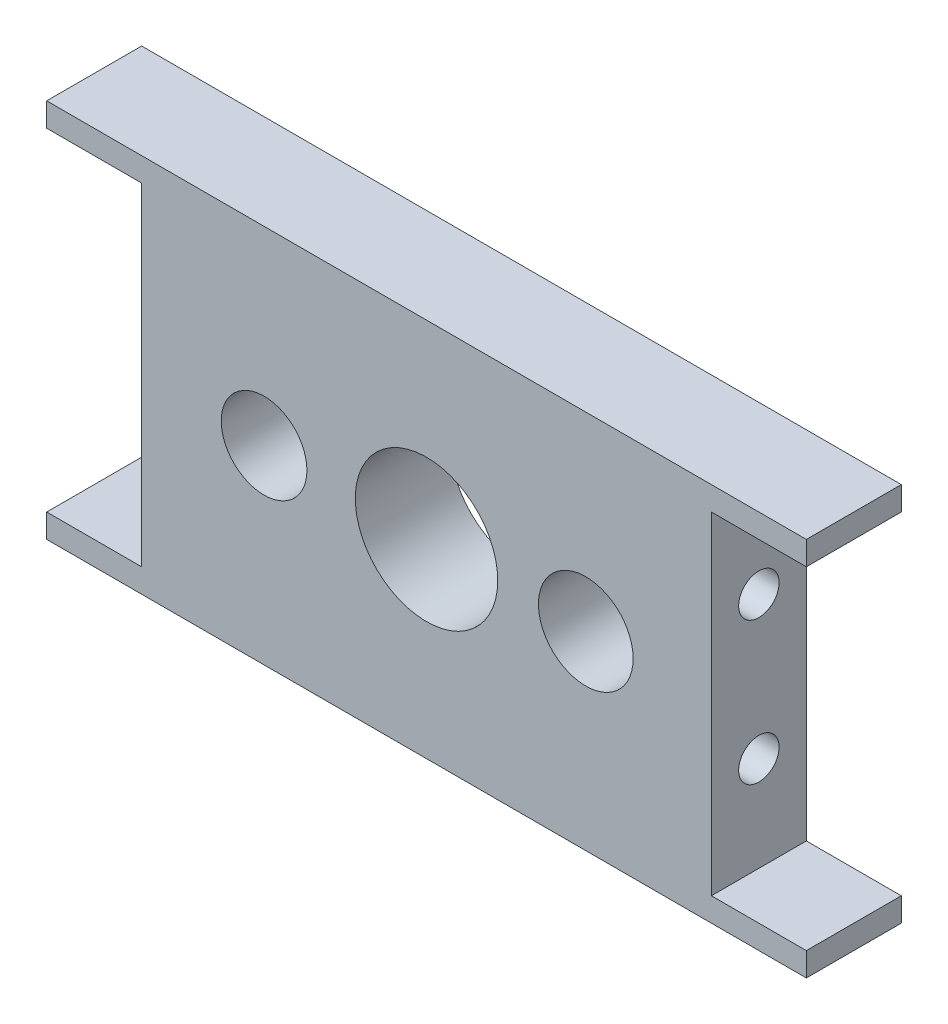
ISO-10303-21;
HEADER;
FILE_DESCRIPTION(('STEP AP214'),'2;1');
FILE_NAME('part.step','',(''),(''),'','','');
FILE_SCHEMA(('AUTOMOTIVE_DESIGN { 1 0 10303 214 1 1 1 1 }'));
ENDSEC;
DATA;
#1=APPLICATION_CONTEXT('core data for automotive mechanical design processes');
#2=APPLICATION_PROTOCOL_DEFINITION('international standard','automotive_design',2000,#1);
#3=PRODUCT_CONTEXT('',#1,'mechanical');
#4=PRODUCT('Part','Part','',(#3));
#5=PRODUCT_RELATED_PRODUCT_CATEGORY('part','',(#4));
#6=PRODUCT_DEFINITION_FORMATION('','',#4);
#7=PRODUCT_DEFINITION_CONTEXT('part definition',#1,'design');
#8=PRODUCT_DEFINITION('design','',#6,#7);
#9=PRODUCT_DEFINITION_SHAPE('','',#8);
#10=(LENGTH_UNIT() NAMED_UNIT(*) SI_UNIT(.MILLI.,.METRE.));
#11=(NAMED_UNIT(*) PLANE_ANGLE_UNIT() SI_UNIT($,.RADIAN.));
#12=(NAMED_UNIT(*) SI_UNIT($,.STERADIAN.) SOLID_ANGLE_UNIT());
#13=UNCERTAINTY_MEASURE_WITH_UNIT(LENGTH_MEASURE(1.E-05),#10,'distance_accuracy_value','');
#14=(GEOMETRIC_REPRESENTATION_CONTEXT(3) GLOBAL_UNCERTAINTY_ASSIGNED_CONTEXT((#13)) GLOBAL_UNIT_ASSIGNED_CONTEXT((#10,
#11,#12)) REPRESENTATION_CONTEXT('',''));
#15=CARTESIAN_POINT('',(0.,0.,0.));
#16=DIRECTION('',(0.,0.,1.));
#17=DIRECTION('',(1.,0.,0.));
#18=AXIS2_PLACEMENT_3D('',#15,#16,#17);
#19=CARTESIAN_POINT('',(0.,0.,6.35));
#20=DIRECTION('',(0.,0.,-1.));
#21=DIRECTION('',(-1.,0.,0.));
#22=AXIS2_PLACEMENT_3D('',#19,#20,#21);
#23=PLANE('',#22);
#24=CARTESIAN_POINT('',(-10.8631003337967,0.,6.35));
#25=DIRECTION('',(0.,0.,1.));
#26=DIRECTION('',(1.,0.,0.));
#27=AXIS2_PLACEMENT_3D('',#24,#25,#26);
#28=CIRCLE('',#27,2.8656483897361);
#29=CARTESIAN_POINT('',(-7.99745194406057,0.,6.35));
#30=VERTEX_POINT('',#29);
#31=EDGE_CURVE('E346',#30,#30,#28,.T.);
#32=ORIENTED_EDGE('',*,*,#31,.F.);
#33=EDGE_LOOP('',(#32));
#34=FACE_BOUND('',#33,.T.);
#35=DIRECTION('',(0.,1.,0.));
#36=VECTOR('',#35,1.);
#37=CARTESIAN_POINT('',(25.4,12.7,6.35));
#38=LINE('',#37,#36);
#39=CARTESIAN_POINT('',(25.4,11.1125,6.35));
#40=VERTEX_POINT('',#39);
#41=CARTESIAN_POINT('',(25.4,12.7,6.35));
#42=VERTEX_POINT('',#41);
#43=EDGE_CURVE('E179',#40,#42,#38,.T.);
#44=ORIENTED_EDGE('',*,*,#43,.T.);
#45=DIRECTION('',(-1.,0.,0.));
#46=VECTOR('',#45,1.);
#47=CARTESIAN_POINT('',(25.4,12.7,6.35));
#48=LINE('',#47,#46);
#49=CARTESIAN_POINT('',(-25.4,12.7,6.35));
#50=VERTEX_POINT('',#49);
#51=EDGE_CURVE('E105',#42,#50,#48,.T.);
#52=ORIENTED_EDGE('',*,*,#51,.T.);
#53=DIRECTION('',(0.,-1.,0.));
#54=VECTOR('',#53,1.);
#55=CARTESIAN_POINT('',(-25.4,12.7,6.35));
#56=LINE('',#55,#54);
#57=CARTESIAN_POINT('',(-25.4,11.1125,6.35));
#58=VERTEX_POINT('',#57);
#59=EDGE_CURVE('E206',#50,#58,#56,.T.);
#60=ORIENTED_EDGE('',*,*,#59,.T.);
#61=DIRECTION('',(1.,0.,0.));
#62=VECTOR('',#61,1.);
#63=CARTESIAN_POINT('',(-25.4,11.1125,6.35));
#64=LINE('',#63,#62);
#65=CARTESIAN_POINT('',(-19.05,11.1125,6.35));
#66=VERTEX_POINT('',#65);
#67=EDGE_CURVE('E225',#58,#66,#64,.T.);
#68=ORIENTED_EDGE('',*,*,#67,.T.);
#69=DIRECTION('',(0.,-1.,0.));
#70=VECTOR('',#69,1.);
#71=CARTESIAN_POINT('',(-19.05,11.1125,6.35));
#72=LINE('',#71,#70);
#73=CARTESIAN_POINT('',(-19.05,-11.1125,6.35));
#74=VERTEX_POINT('',#73);
#75=EDGE_CURVE('E222',#66,#74,#72,.T.);
#76=ORIENTED_EDGE('',*,*,#75,.T.);
#77=DIRECTION('',(-1.,0.,0.));
#78=VECTOR('',#77,1.);
#79=CARTESIAN_POINT('',(-25.4,-11.1125,6.35));
#80=LINE('',#79,#78);
#81=CARTESIAN_POINT('',(-25.4,-11.1125,6.35));
#82=VERTEX_POINT('',#81);
#83=EDGE_CURVE('E224',#74,#82,#80,.T.);
#84=ORIENTED_EDGE('',*,*,#83,.T.);
#85=DIRECTION('',(0.,-1.,0.));
#86=VECTOR('',#85,1.);
#87=CARTESIAN_POINT('',(-25.4,-11.1125,6.35));
#88=LINE('',#87,#86);
#89=CARTESIAN_POINT('',(-25.4,-12.7,6.35));
#90=VERTEX_POINT('',#89);
#91=EDGE_CURVE('E227',#82,#90,#88,.T.);
#92=ORIENTED_EDGE('',*,*,#91,.T.);
#93=DIRECTION('',(1.,0.,0.));
#94=VECTOR('',#93,1.);
#95=CARTESIAN_POINT('',(25.4,-12.7,6.35));
#96=LINE('',#95,#94);
#97=CARTESIAN_POINT('',(25.4,-12.7,6.35));
#98=VERTEX_POINT('',#97);
#99=EDGE_CURVE('E233',#90,#98,#96,.T.);
#100=ORIENTED_EDGE('',*,*,#99,.T.);
#101=DIRECTION('',(0.,1.,0.));
#102=VECTOR('',#101,1.);
#103=CARTESIAN_POINT('',(25.4,-11.1125,6.35));
#104=LINE('',#103,#102);
#105=CARTESIAN_POINT('',(25.4,-11.1125,6.35));
#106=VERTEX_POINT('',#105);
#107=EDGE_CURVE('E138',#98,#106,#104,.T.);
#108=ORIENTED_EDGE('',*,*,#107,.T.);
#109=DIRECTION('',(-1.,0.,0.));
#110=VECTOR('',#109,1.);
#111=CARTESIAN_POINT('',(25.4,-11.1125,6.35));
#112=LINE('',#111,#110);
#113=CARTESIAN_POINT('',(19.05,-11.1125,6.35));
#114=VERTEX_POINT('',#113);
#115=EDGE_CURVE('E132',#106,#114,#112,.T.);
#116=ORIENTED_EDGE('',*,*,#115,.T.);
#117=DIRECTION('',(0.,1.,0.));
#118=VECTOR('',#117,1.);
#119=CARTESIAN_POINT('',(19.05,11.1125,6.35));
#120=LINE('',#119,#118);
#121=CARTESIAN_POINT('',(19.05,11.1125,6.35));
#122=VERTEX_POINT('',#121);
#123=EDGE_CURVE('E136',#114,#122,#120,.T.);
#124=ORIENTED_EDGE('',*,*,#123,.T.);
#125=DIRECTION('',(1.,0.,0.));
#126=VECTOR('',#125,1.);
#127=CARTESIAN_POINT('',(25.4,11.1125,6.35));
#128=LINE('',#127,#126);
#129=EDGE_CURVE('E49',#122,#40,#128,.T.);
#130=ORIENTED_EDGE('',*,*,#129,.T.);
#131=EDGE_LOOP('',(#44,#52,#60,#68,#76,#84,#92,#100,#108,#116,#124,#130));
#132=FACE_BOUND('',#131,.T.);
#133=CARTESIAN_POINT('',(0.,0.,6.35));
#134=DIRECTION('',(0.,0.,1.));
#135=DIRECTION('',(1.,0.,0.));
#136=AXIS2_PLACEMENT_3D('',#133,#134,#135);
#137=CIRCLE('',#136,4.7625);
#138=CARTESIAN_POINT('',(4.7625,0.,6.35));
#139=VERTEX_POINT('',#138);
#140=EDGE_CURVE('E160',#139,#139,#137,.T.);
#141=ORIENTED_EDGE('',*,*,#140,.F.);
#142=EDGE_LOOP('',(#141));
#143=FACE_BOUND('',#142,.T.);
#144=CARTESIAN_POINT('',(10.6500983664673,0.,6.35));
#145=DIRECTION('',(0.,0.,1.));
#146=DIRECTION('',(1.,0.,0.));
#147=AXIS2_PLACEMENT_3D('',#144,#145,#146);
#148=CIRCLE('',#147,3.16650188963215);
#149=CARTESIAN_POINT('',(13.8166002560994,0.,6.35));
#150=VERTEX_POINT('',#149);
#151=EDGE_CURVE('E340',#150,#150,#148,.T.);
#152=ORIENTED_EDGE('',*,*,#151,.F.);
#153=EDGE_LOOP('',(#152));
#154=FACE_BOUND('',#153,.T.);
#155=ADVANCED_FACE('F32',(#34,#132,#143,#154),#23,.F.);
#156=CARTESIAN_POINT('',(0.,0.,0.));
#157=DIRECTION('',(0.,0.,-1.));
#158=DIRECTION('',(-1.,0.,0.));
#159=AXIS2_PLACEMENT_3D('',#156,#157,#158);
#160=PLANE('',#159);
#161=CARTESIAN_POINT('',(-10.8631003337967,0.,0.));
#162=DIRECTION('',(0.,0.,1.));
#163=DIRECTION('',(1.,0.,0.));
#164=AXIS2_PLACEMENT_3D('',#161,#162,#163);
#165=CIRCLE('',#164,2.8656483897361);
#166=CARTESIAN_POINT('',(-7.99745194406057,0.,0.));
#167=VERTEX_POINT('',#166);
#168=EDGE_CURVE('E343',#167,#167,#165,.T.);
#169=ORIENTED_EDGE('',*,*,#168,.T.);
#170=EDGE_LOOP('',(#169));
#171=FACE_BOUND('',#170,.T.);
#172=DIRECTION('',(0.,1.,0.));
#173=VECTOR('',#172,1.);
#174=CARTESIAN_POINT('',(25.4,12.7,0.));
#175=LINE('',#174,#173);
#176=CARTESIAN_POINT('',(25.4,11.1125,0.));
#177=VERTEX_POINT('',#176);
#178=CARTESIAN_POINT('',(25.4,12.7,0.));
#179=VERTEX_POINT('',#178);
#180=EDGE_CURVE('E156',#177,#179,#175,.T.);
#181=ORIENTED_EDGE('',*,*,#180,.F.);
#182=DIRECTION('',(1.,0.,0.));
#183=VECTOR('',#182,1.);
#184=CARTESIAN_POINT('',(25.4,11.1125,0.));
#185=LINE('',#184,#183);
#186=CARTESIAN_POINT('',(19.05,11.1125,0.));
#187=VERTEX_POINT('',#186);
#188=EDGE_CURVE('E97',#187,#177,#185,.T.);
#189=ORIENTED_EDGE('',*,*,#188,.F.);
#190=DIRECTION('',(0.,1.,0.));
#191=VECTOR('',#190,1.);
#192=CARTESIAN_POINT('',(19.05,11.1125,0.));
#193=LINE('',#192,#191);
#194=CARTESIAN_POINT('',(19.05,-11.1125,0.));
#195=VERTEX_POINT('',#194);
#196=EDGE_CURVE('E91',#195,#187,#193,.T.);
#197=ORIENTED_EDGE('',*,*,#196,.F.);
#198=DIRECTION('',(-1.,0.,0.));
#199=VECTOR('',#198,1.);
#200=CARTESIAN_POINT('',(25.4,-11.1125,0.));
#201=LINE('',#200,#199);
#202=CARTESIAN_POINT('',(25.4,-11.1125,0.));
#203=VERTEX_POINT('',#202);
#204=EDGE_CURVE('E146',#203,#195,#201,.T.);
#205=ORIENTED_EDGE('',*,*,#204,.F.);
#206=DIRECTION('',(0.,1.,0.));
#207=VECTOR('',#206,1.);
#208=CARTESIAN_POINT('',(25.4,-11.1125,0.));
#209=LINE('',#208,#207);
#210=CARTESIAN_POINT('',(25.4,-12.7,0.));
#211=VERTEX_POINT('',#210);
#212=EDGE_CURVE('E174',#211,#203,#209,.T.);
#213=ORIENTED_EDGE('',*,*,#212,.F.);
#214=DIRECTION('',(1.,0.,0.));
#215=VECTOR('',#214,1.);
#216=CARTESIAN_POINT('',(25.4,-12.7,0.));
#217=LINE('',#216,#215);
#218=CARTESIAN_POINT('',(-25.4,-12.7,0.));
#219=VERTEX_POINT('',#218);
#220=EDGE_CURVE('E172',#219,#211,#217,.T.);
#221=ORIENTED_EDGE('',*,*,#220,.F.);
#222=DIRECTION('',(0.,-1.,0.));
#223=VECTOR('',#222,1.);
#224=CARTESIAN_POINT('',(-25.4,-11.1125,0.));
#225=LINE('',#224,#223);
#226=CARTESIAN_POINT('',(-25.4,-11.1125,0.));
#227=VERTEX_POINT('',#226);
#228=EDGE_CURVE('E170',#227,#219,#225,.T.);
#229=ORIENTED_EDGE('',*,*,#228,.F.);
#230=DIRECTION('',(-1.,0.,0.));
#231=VECTOR('',#230,1.);
#232=CARTESIAN_POINT('',(-25.4,-11.1125,0.));
#233=LINE('',#232,#231);
#234=CARTESIAN_POINT('',(-19.05,-11.1125,0.));
#235=VERTEX_POINT('',#234);
#236=EDGE_CURVE('E168',#235,#227,#233,.T.);
#237=ORIENTED_EDGE('',*,*,#236,.F.);
#238=DIRECTION('',(0.,-1.,0.));
#239=VECTOR('',#238,1.);
#240=CARTESIAN_POINT('',(-19.05,11.1125,0.));
#241=LINE('',#240,#239);
#242=CARTESIAN_POINT('',(-19.05,11.1125,0.));
#243=VERTEX_POINT('',#242);
#244=EDGE_CURVE('E166',#243,#235,#241,.T.);
#245=ORIENTED_EDGE('',*,*,#244,.F.);
#246=DIRECTION('',(1.,0.,0.));
#247=VECTOR('',#246,1.);
#248=CARTESIAN_POINT('',(-25.4,11.1125,0.));
#249=LINE('',#248,#247);
#250=CARTESIAN_POINT('',(-25.4,11.1125,0.));
#251=VERTEX_POINT('',#250);
#252=EDGE_CURVE('E164',#251,#243,#249,.T.);
#253=ORIENTED_EDGE('',*,*,#252,.F.);
#254=DIRECTION('',(0.,-1.,0.));
#255=VECTOR('',#254,1.);
#256=CARTESIAN_POINT('',(-25.4,12.7,0.));
#257=LINE('',#256,#255);
#258=CARTESIAN_POINT('',(-25.4,12.7,0.));
#259=VERTEX_POINT('',#258);
#260=EDGE_CURVE('E162',#259,#251,#257,.T.);
#261=ORIENTED_EDGE('',*,*,#260,.F.);
#262=DIRECTION('',(-1.,0.,0.));
#263=VECTOR('',#262,1.);
#264=CARTESIAN_POINT('',(25.4,12.7,0.));
#265=LINE('',#264,#263);
#266=EDGE_CURVE('E159',#179,#259,#265,.T.);
#267=ORIENTED_EDGE('',*,*,#266,.F.);
#268=EDGE_LOOP('',(#181,#189,#197,#205,#213,#221,#229,#237,#245,#253,#261,#267));
#269=FACE_BOUND('',#268,.T.);
#270=CARTESIAN_POINT('',(0.,0.,0.));
#271=DIRECTION('',(0.,0.,1.));
#272=DIRECTION('',(1.,0.,0.));
#273=AXIS2_PLACEMENT_3D('',#270,#271,#272);
#274=CIRCLE('',#273,4.7625);
#275=CARTESIAN_POINT('',(4.7625,0.,0.));
#276=VERTEX_POINT('',#275);
#277=EDGE_CURVE('E349',#276,#276,#274,.T.);
#278=ORIENTED_EDGE('',*,*,#277,.T.);
#279=EDGE_LOOP('',(#278));
#280=FACE_BOUND('',#279,.T.);
#281=CARTESIAN_POINT('',(10.6500983664673,0.,0.));
#282=DIRECTION('',(0.,0.,1.));
#283=DIRECTION('',(1.,0.,0.));
#284=AXIS2_PLACEMENT_3D('',#281,#282,#283);
#285=CIRCLE('',#284,3.16650188963215);
#286=CARTESIAN_POINT('',(13.8166002560994,0.,0.));
#287=VERTEX_POINT('',#286);
#288=EDGE_CURVE('E339',#287,#287,#285,.T.);
#289=ORIENTED_EDGE('',*,*,#288,.T.);
#290=EDGE_LOOP('',(#289));
#291=FACE_BOUND('',#290,.T.);
#292=ADVANCED_FACE('F210',(#171,#269,#280,#291),#160,.T.);
#293=CARTESIAN_POINT('',(25.4,12.7,6.35));
#294=DIRECTION('',(-1.,0.,0.));
#295=DIRECTION('',(0.,-1.,0.));
#296=AXIS2_PLACEMENT_3D('',#293,#294,#295);
#297=PLANE('',#296);
#298=ORIENTED_EDGE('',*,*,#180,.T.);
#299=DIRECTION('',(0.,0.,-1.));
#300=VECTOR('',#299,1.);
#301=CARTESIAN_POINT('',(25.4,12.7,6.35));
#302=LINE('',#301,#300);
#303=EDGE_CURVE('E11',#42,#179,#302,.T.);
#304=ORIENTED_EDGE('',*,*,#303,.F.);
#305=ORIENTED_EDGE('',*,*,#43,.F.);
#306=DIRECTION('',(0.,0.,-1.));
#307=VECTOR('',#306,1.);
#308=CARTESIAN_POINT('',(25.4,11.1125,6.35));
#309=LINE('',#308,#307);
#310=EDGE_CURVE('E152',#40,#177,#309,.T.);
#311=ORIENTED_EDGE('',*,*,#310,.T.);
#312=EDGE_LOOP('',(#298,#304,#305,#311));
#313=FACE_BOUND('',#312,.T.);
#314=ADVANCED_FACE('F34',(#313),#297,.F.);
#315=CARTESIAN_POINT('',(25.4,12.7,6.35));
#316=DIRECTION('',(0.,-1.,0.));
#317=DIRECTION('',(1.,0.,0.));
#318=AXIS2_PLACEMENT_3D('',#315,#316,#317);
#319=PLANE('',#318);
#320=ORIENTED_EDGE('',*,*,#266,.T.);
#321=DIRECTION('',(0.,0.,-1.));
#322=VECTOR('',#321,1.);
#323=CARTESIAN_POINT('',(-25.4,12.7,6.35));
#324=LINE('',#323,#322);
#325=EDGE_CURVE('E41',#50,#259,#324,.T.);
#326=ORIENTED_EDGE('',*,*,#325,.F.);
#327=ORIENTED_EDGE('',*,*,#51,.F.);
#328=ORIENTED_EDGE('',*,*,#303,.T.);
#329=EDGE_LOOP('',(#320,#326,#327,#328));
#330=FACE_BOUND('',#329,.T.);
#331=ADVANCED_FACE('F395',(#330),#319,.F.);
#332=CARTESIAN_POINT('',(-25.4,12.7,6.35));
#333=DIRECTION('',(1.,0.,0.));
#334=DIRECTION('',(0.,0.,-1.));
#335=AXIS2_PLACEMENT_3D('',#332,#333,#334);
#336=PLANE('',#335);
#337=ORIENTED_EDGE('',*,*,#260,.T.);
#338=DIRECTION('',(0.,0.,-1.));
#339=VECTOR('',#338,1.);
#340=CARTESIAN_POINT('',(-25.4,11.1125,6.35));
#341=LINE('',#340,#339);
#342=EDGE_CURVE('E198',#58,#251,#341,.T.);
#343=ORIENTED_EDGE('',*,*,#342,.F.);
#344=ORIENTED_EDGE('',*,*,#59,.F.);
#345=ORIENTED_EDGE('',*,*,#325,.T.);
#346=EDGE_LOOP('',(#337,#343,#344,#345));
#347=FACE_BOUND('',#346,.T.);
#348=ADVANCED_FACE('F204',(#347),#336,.F.);
#349=CARTESIAN_POINT('',(-25.4,11.1125,6.35));
#350=DIRECTION('',(0.,1.,0.));
#351=DIRECTION('',(0.,0.,1.));
#352=AXIS2_PLACEMENT_3D('',#349,#350,#351);
#353=PLANE('',#352);
#354=ORIENTED_EDGE('',*,*,#252,.T.);
#355=DIRECTION('',(0.,0.,-1.));
#356=VECTOR('',#355,1.);
#357=CARTESIAN_POINT('',(-19.05,11.1125,6.35));
#358=LINE('',#357,#356);
#359=EDGE_CURVE('E195',#66,#243,#358,.T.);
#360=ORIENTED_EDGE('',*,*,#359,.F.);
#361=ORIENTED_EDGE('',*,*,#67,.F.);
#362=ORIENTED_EDGE('',*,*,#342,.T.);
#363=EDGE_LOOP('',(#354,#360,#361,#362));
#364=FACE_BOUND('',#363,.T.);
#365=ADVANCED_FACE('F216',(#364),#353,.F.);
#366=CARTESIAN_POINT('',(-19.05,11.1125,6.35));
#367=DIRECTION('',(1.,0.,0.));
#368=DIRECTION('',(0.,1.,0.));
#369=AXIS2_PLACEMENT_3D('',#366,#367,#368);
#370=PLANE('',#369);
#371=CARTESIAN_POINT('',(-19.05,4.76249999999992,3.175));
#372=DIRECTION('',(-1.,0.,0.));
#373=DIRECTION('',(0.,0.,1.));
#374=AXIS2_PLACEMENT_3D('',#371,#372,#373);
#375=CIRCLE('',#374,1.35254999999999);
#376=CARTESIAN_POINT('',(-19.05,4.76249999999992,4.52754999999999));
#377=VERTEX_POINT('',#376);
#378=EDGE_CURVE('E316',#377,#377,#375,.T.);
#379=ORIENTED_EDGE('',*,*,#378,.F.);
#380=EDGE_LOOP('',(#379));
#381=FACE_BOUND('',#380,.T.);
#382=CARTESIAN_POINT('',(-19.05,-4.76250000000008,3.175));
#383=DIRECTION('',(-1.,0.,0.));
#384=DIRECTION('',(0.,0.,1.));
#385=AXIS2_PLACEMENT_3D('',#382,#383,#384);
#386=CIRCLE('',#385,1.35254999999999);
#387=CARTESIAN_POINT('',(-19.05,-4.76250000000008,4.52754999999999));
#388=VERTEX_POINT('',#387);
#389=EDGE_CURVE('E319',#388,#388,#386,.T.);
#390=ORIENTED_EDGE('',*,*,#389,.F.);
#391=EDGE_LOOP('',(#390));
#392=FACE_BOUND('',#391,.T.);
#393=ORIENTED_EDGE('',*,*,#244,.T.);
#394=DIRECTION('',(0.,0.,-1.));
#395=VECTOR('',#394,1.);
#396=CARTESIAN_POINT('',(-19.05,-11.1125,6.35));
#397=LINE('',#396,#395);
#398=EDGE_CURVE('E192',#74,#235,#397,.T.);
#399=ORIENTED_EDGE('',*,*,#398,.F.);
#400=ORIENTED_EDGE('',*,*,#75,.F.);
#401=ORIENTED_EDGE('',*,*,#359,.T.);
#402=EDGE_LOOP('',(#393,#399,#400,#401));
#403=FACE_BOUND('',#402,.T.);
#404=ADVANCED_FACE('F220',(#381,#392,#403),#370,.F.);
#405=CARTESIAN_POINT('',(-25.4,-11.1125,6.35));
#406=DIRECTION('',(0.,-1.,0.));
#407=DIRECTION('',(0.,0.,-1.));
#408=AXIS2_PLACEMENT_3D('',#405,#406,#407);
#409=PLANE('',#408);
#410=ORIENTED_EDGE('',*,*,#236,.T.);
#411=DIRECTION('',(0.,0.,-1.));
#412=VECTOR('',#411,1.);
#413=CARTESIAN_POINT('',(-25.4,-11.1125,6.35));
#414=LINE('',#413,#412);
#415=EDGE_CURVE('E189',#82,#227,#414,.T.);
#416=ORIENTED_EDGE('',*,*,#415,.F.);
#417=ORIENTED_EDGE('',*,*,#83,.F.);
#418=ORIENTED_EDGE('',*,*,#398,.T.);
#419=EDGE_LOOP('',(#410,#416,#417,#418));
#420=FACE_BOUND('',#419,.T.);
#421=ADVANCED_FACE('F382',(#420),#409,.F.);
#422=CARTESIAN_POINT('',(-25.4,-11.1125,6.35));
#423=DIRECTION('',(1.,0.,0.));
#424=DIRECTION('',(0.,0.,-1.));
#425=AXIS2_PLACEMENT_3D('',#422,#423,#424);
#426=PLANE('',#425);
#427=ORIENTED_EDGE('',*,*,#228,.T.);
#428=DIRECTION('',(0.,0.,-1.));
#429=VECTOR('',#428,1.);
#430=CARTESIAN_POINT('',(-25.4,-12.7,6.35));
#431=LINE('',#430,#429);
#432=EDGE_CURVE('E186',#90,#219,#431,.T.);
#433=ORIENTED_EDGE('',*,*,#432,.F.);
#434=ORIENTED_EDGE('',*,*,#91,.F.);
#435=ORIENTED_EDGE('',*,*,#415,.T.);
#436=EDGE_LOOP('',(#427,#433,#434,#435));
#437=FACE_BOUND('',#436,.T.);
#438=ADVANCED_FACE('F388',(#437),#426,.F.);
#439=CARTESIAN_POINT('',(25.4,-12.7,6.35));
#440=DIRECTION('',(0.,1.,0.));
#441=DIRECTION('',(-1.,0.,0.));
#442=AXIS2_PLACEMENT_3D('',#439,#440,#441);
#443=PLANE('',#442);
#444=ORIENTED_EDGE('',*,*,#220,.T.);
#445=DIRECTION('',(0.,0.,-1.));
#446=VECTOR('',#445,1.);
#447=CARTESIAN_POINT('',(25.4,-12.7,6.35));
#448=LINE('',#447,#446);
#449=EDGE_CURVE('E183',#98,#211,#448,.T.);
#450=ORIENTED_EDGE('',*,*,#449,.F.);
#451=ORIENTED_EDGE('',*,*,#99,.F.);
#452=ORIENTED_EDGE('',*,*,#432,.T.);
#453=EDGE_LOOP('',(#444,#450,#451,#452));
#454=FACE_BOUND('',#453,.T.);
#455=ADVANCED_FACE('F239',(#454),#443,.F.);
#456=CARTESIAN_POINT('',(25.4,-11.1125,6.35));
#457=DIRECTION('',(-1.,0.,0.));
#458=DIRECTION('',(0.,0.,1.));
#459=AXIS2_PLACEMENT_3D('',#456,#457,#458);
#460=PLANE('',#459);
#461=ORIENTED_EDGE('',*,*,#212,.T.);
#462=DIRECTION('',(0.,0.,-1.));
#463=VECTOR('',#462,1.);
#464=CARTESIAN_POINT('',(25.4,-11.1125,6.35));
#465=LINE('',#464,#463);
#466=EDGE_CURVE('E147',#106,#203,#465,.T.);
#467=ORIENTED_EDGE('',*,*,#466,.F.);
#468=ORIENTED_EDGE('',*,*,#107,.F.);
#469=ORIENTED_EDGE('',*,*,#449,.T.);
#470=EDGE_LOOP('',(#461,#467,#468,#469));
#471=FACE_BOUND('',#470,.T.);
#472=ADVANCED_FACE('F243',(#471),#460,.F.);
#473=CARTESIAN_POINT('',(25.4,-11.1125,6.35));
#474=DIRECTION('',(0.,-1.,0.));
#475=DIRECTION('',(0.,0.,-1.));
#476=AXIS2_PLACEMENT_3D('',#473,#474,#475);
#477=PLANE('',#476);
#478=ORIENTED_EDGE('',*,*,#204,.T.);
#479=DIRECTION('',(0.,0.,-1.));
#480=VECTOR('',#479,1.);
#481=CARTESIAN_POINT('',(19.05,-11.1125,6.35));
#482=LINE('',#481,#480);
#483=EDGE_CURVE('E143',#114,#195,#482,.T.);
#484=ORIENTED_EDGE('',*,*,#483,.F.);
#485=ORIENTED_EDGE('',*,*,#115,.F.);
#486=ORIENTED_EDGE('',*,*,#466,.T.);
#487=EDGE_LOOP('',(#478,#484,#485,#486));
#488=FACE_BOUND('',#487,.T.);
#489=ADVANCED_FACE('F144',(#488),#477,.F.);
#490=CARTESIAN_POINT('',(19.05,11.1125,6.35));
#491=DIRECTION('',(-1.,0.,0.));
#492=DIRECTION('',(0.,-1.,0.));
#493=AXIS2_PLACEMENT_3D('',#490,#491,#492);
#494=PLANE('',#493);
#495=CARTESIAN_POINT('',(19.05,4.76249999999992,3.175));
#496=DIRECTION('',(1.,0.,0.));
#497=DIRECTION('',(0.,0.,-1.));
#498=AXIS2_PLACEMENT_3D('',#495,#496,#497);
#499=CIRCLE('',#498,1.35254999999999);
#500=CARTESIAN_POINT('',(19.05,4.76249999999992,1.82245000000001));
#501=VERTEX_POINT('',#500);
#502=EDGE_CURVE('E327',#501,#501,#499,.T.);
#503=ORIENTED_EDGE('',*,*,#502,.F.);
#504=EDGE_LOOP('',(#503));
#505=FACE_BOUND('',#504,.T.);
#506=CARTESIAN_POINT('',(19.05,-4.76250000000008,3.175));
#507=DIRECTION('',(1.,0.,0.));
#508=DIRECTION('',(0.,0.,-1.));
#509=AXIS2_PLACEMENT_3D('',#506,#507,#508);
#510=CIRCLE('',#509,1.35254999999999);
#511=CARTESIAN_POINT('',(19.05,-4.76250000000008,1.82245000000001));
#512=VERTEX_POINT('',#511);
#513=EDGE_CURVE('E333',#512,#512,#510,.T.);
#514=ORIENTED_EDGE('',*,*,#513,.F.);
#515=EDGE_LOOP('',(#514));
#516=FACE_BOUND('',#515,.T.);
#517=ORIENTED_EDGE('',*,*,#196,.T.);
#518=DIRECTION('',(0.,0.,-1.));
#519=VECTOR('',#518,1.);
#520=CARTESIAN_POINT('',(19.05,11.1125,6.35));
#521=LINE('',#520,#519);
#522=EDGE_CURVE('E148',#122,#187,#521,.T.);
#523=ORIENTED_EDGE('',*,*,#522,.F.);
#524=ORIENTED_EDGE('',*,*,#123,.F.);
#525=ORIENTED_EDGE('',*,*,#483,.T.);
#526=EDGE_LOOP('',(#517,#523,#524,#525));
#527=FACE_BOUND('',#526,.T.);
#528=ADVANCED_FACE('F150',(#505,#516,#527),#494,.F.);
#529=CARTESIAN_POINT('',(25.4,11.1125,6.35));
#530=DIRECTION('',(0.,1.,0.));
#531=DIRECTION('',(0.,0.,1.));
#532=AXIS2_PLACEMENT_3D('',#529,#530,#531);
#533=PLANE('',#532);
#534=ORIENTED_EDGE('',*,*,#188,.T.);
#535=ORIENTED_EDGE('',*,*,#310,.F.);
#536=ORIENTED_EDGE('',*,*,#129,.F.);
#537=ORIENTED_EDGE('',*,*,#522,.T.);
#538=EDGE_LOOP('',(#534,#535,#536,#537));
#539=FACE_BOUND('',#538,.T.);
#540=ADVANCED_FACE('F247',(#539),#533,.F.);
#541=CARTESIAN_POINT('',(0.,0.,6.35));
#542=DIRECTION('',(0.,0.,-1.));
#543=DIRECTION('',(-1.,0.,0.));
#544=AXIS2_PLACEMENT_3D('',#541,#542,#543);
#545=CYLINDRICAL_SURFACE('',#544,4.7625);
#546=ORIENTED_EDGE('',*,*,#140,.T.);
#547=EDGE_LOOP('',(#546));
#548=FACE_BOUND('',#547,.T.);
#549=ORIENTED_EDGE('',*,*,#277,.F.);
#550=EDGE_LOOP('',(#549));
#551=FACE_BOUND('',#550,.T.);
#552=ADVANCED_FACE('F249',(#548,#551),#545,.F.);
#553=CARTESIAN_POINT('',(-10.8631003337967,0.,6.35));
#554=DIRECTION('',(0.,0.,-1.));
#555=DIRECTION('',(-1.,0.,0.));
#556=AXIS2_PLACEMENT_3D('',#553,#554,#555);
#557=CYLINDRICAL_SURFACE('',#556,2.8656483897361);
#558=ORIENTED_EDGE('',*,*,#31,.T.);
#559=EDGE_LOOP('',(#558));
#560=FACE_BOUND('',#559,.T.);
#561=ORIENTED_EDGE('',*,*,#168,.F.);
#562=EDGE_LOOP('',(#561));
#563=FACE_BOUND('',#562,.T.);
#564=ADVANCED_FACE('F255',(#560,#563),#557,.F.);
#565=CARTESIAN_POINT('',(10.6500983664673,0.,6.35));
#566=DIRECTION('',(0.,0.,-1.));
#567=DIRECTION('',(-1.,0.,0.));
#568=AXIS2_PLACEMENT_3D('',#565,#566,#567);
#569=CYLINDRICAL_SURFACE('',#568,3.16650188963215);
#570=ORIENTED_EDGE('',*,*,#151,.T.);
#571=EDGE_LOOP('',(#570));
#572=FACE_BOUND('',#571,.T.);
#573=ORIENTED_EDGE('',*,*,#288,.F.);
#574=EDGE_LOOP('',(#573));
#575=FACE_BOUND('',#574,.T.);
#576=ADVANCED_FACE('F272',(#572,#575),#569,.F.);
#577=CARTESIAN_POINT('',(12.7,-4.76250000000008,3.175));
#578=DIRECTION('',(1.,0.,0.));
#579=DIRECTION('',(0.,0.,-1.));
#580=AXIS2_PLACEMENT_3D('',#577,#578,#579);
#581=CONICAL_SURFACE('',#580,1.35255,1.02974425867665);
#582=CARTESIAN_POINT('',(11.8873059697343,-4.76250000000008,3.175));
#583=VERTEX_POINT('',#582);
#584=VERTEX_LOOP('',#583);
#585=FACE_BOUND('',#584,.T.);
#586=CARTESIAN_POINT('',(12.7,-4.76250000000008,3.175));
#587=DIRECTION('',(1.,0.,0.));
#588=DIRECTION('',(0.,0.,-1.));
#589=AXIS2_PLACEMENT_3D('',#586,#587,#588);
#590=CIRCLE('',#589,1.35255);
#591=CARTESIAN_POINT('',(12.7,-4.76250000000008,1.82245));
#592=VERTEX_POINT('',#591);
#593=EDGE_CURVE('E336',#592,#592,#590,.T.);
#594=ORIENTED_EDGE('',*,*,#593,.T.);
#595=EDGE_LOOP('',(#594));
#596=FACE_BOUND('',#595,.T.);
#597=ADVANCED_FACE('F276',(#585,#596),#581,.F.);
#598=CARTESIAN_POINT('',(19.05,-4.76250000000008,3.175));
#599=DIRECTION('',(1.,0.,0.));
#600=DIRECTION('',(0.,0.,-1.));
#601=AXIS2_PLACEMENT_3D('',#598,#599,#600);
#602=CYLINDRICAL_SURFACE('',#601,1.35254999999999);
#603=ORIENTED_EDGE('',*,*,#593,.F.);
#604=EDGE_LOOP('',(#603));
#605=FACE_BOUND('',#604,.T.);
#606=ORIENTED_EDGE('',*,*,#513,.T.);
#607=EDGE_LOOP('',(#606));
#608=FACE_BOUND('',#607,.T.);
#609=ADVANCED_FACE('F280',(#605,#608),#602,.F.);
#610=CARTESIAN_POINT('',(12.7,4.76249999999992,3.175));
#611=DIRECTION('',(1.,0.,0.));
#612=DIRECTION('',(0.,0.,-1.));
#613=AXIS2_PLACEMENT_3D('',#610,#611,#612);
#614=CONICAL_SURFACE('',#613,1.35255,1.02974425867665);
#615=CARTESIAN_POINT('',(11.8873059697343,4.76249999999992,3.175));
#616=VERTEX_POINT('',#615);
#617=VERTEX_LOOP('',#616);
#618=FACE_BOUND('',#617,.T.);
#619=CARTESIAN_POINT('',(12.7,4.76249999999992,3.175));
#620=DIRECTION('',(1.,0.,0.));
#621=DIRECTION('',(0.,0.,-1.));
#622=AXIS2_PLACEMENT_3D('',#619,#620,#621);
#623=CIRCLE('',#622,1.35255);
#624=CARTESIAN_POINT('',(12.7,4.76249999999992,1.82245));
#625=VERTEX_POINT('',#624);
#626=EDGE_CURVE('E330',#625,#625,#623,.T.);
#627=ORIENTED_EDGE('',*,*,#626,.T.);
#628=EDGE_LOOP('',(#627));
#629=FACE_BOUND('',#628,.T.);
#630=ADVANCED_FACE('F284',(#618,#629),#614,.F.);
#631=CARTESIAN_POINT('',(19.05,4.76249999999992,3.175));
#632=DIRECTION('',(1.,0.,0.));
#633=DIRECTION('',(0.,0.,-1.));
#634=AXIS2_PLACEMENT_3D('',#631,#632,#633);
#635=CYLINDRICAL_SURFACE('',#634,1.35254999999999);
#636=ORIENTED_EDGE('',*,*,#626,.F.);
#637=EDGE_LOOP('',(#636));
#638=FACE_BOUND('',#637,.T.);
#639=ORIENTED_EDGE('',*,*,#502,.T.);
#640=EDGE_LOOP('',(#639));
#641=FACE_BOUND('',#640,.T.);
#642=ADVANCED_FACE('F288',(#638,#641),#635,.F.);
#643=CARTESIAN_POINT('',(-12.7,-4.76250000000008,3.175));
#644=DIRECTION('',(-1.,0.,0.));
#645=DIRECTION('',(0.,0.,1.));
#646=AXIS2_PLACEMENT_3D('',#643,#644,#645);
#647=CONICAL_SURFACE('',#646,1.35255,1.02974425867665);
#648=CARTESIAN_POINT('',(-11.8873059697343,-4.76250000000008,3.175));
#649=VERTEX_POINT('',#648);
#650=VERTEX_LOOP('',#649);
#651=FACE_BOUND('',#650,.T.);
#652=CARTESIAN_POINT('',(-12.7,-4.76250000000008,3.175));
#653=DIRECTION('',(-1.,0.,0.));
#654=DIRECTION('',(0.,0.,1.));
#655=AXIS2_PLACEMENT_3D('',#652,#653,#654);
#656=CIRCLE('',#655,1.35255);
#657=CARTESIAN_POINT('',(-12.7,-4.76250000000008,4.52754999999999));
#658=VERTEX_POINT('',#657);
#659=EDGE_CURVE('E324',#658,#658,#656,.T.);
#660=ORIENTED_EDGE('',*,*,#659,.T.);
#661=EDGE_LOOP('',(#660));
#662=FACE_BOUND('',#661,.T.);
#663=ADVANCED_FACE('F292',(#651,#662),#647,.F.);
#664=CARTESIAN_POINT('',(-19.05,-4.76250000000008,3.175));
#665=DIRECTION('',(-1.,0.,0.));
#666=DIRECTION('',(0.,0.,1.));
#667=AXIS2_PLACEMENT_3D('',#664,#665,#666);
#668=CYLINDRICAL_SURFACE('',#667,1.35254999999999);
#669=ORIENTED_EDGE('',*,*,#659,.F.);
#670=EDGE_LOOP('',(#669));
#671=FACE_BOUND('',#670,.T.);
#672=ORIENTED_EDGE('',*,*,#389,.T.);
#673=EDGE_LOOP('',(#672));
#674=FACE_BOUND('',#673,.T.);
#675=ADVANCED_FACE('F296',(#671,#674),#668,.F.);
#676=CARTESIAN_POINT('',(-12.7,4.76249999999992,3.175));
#677=DIRECTION('',(-1.,0.,0.));
#678=DIRECTION('',(0.,0.,1.));
#679=AXIS2_PLACEMENT_3D('',#676,#677,#678);
#680=CONICAL_SURFACE('',#679,1.35255,1.02974425867665);
#681=CARTESIAN_POINT('',(-11.8873059697343,4.76249999999992,3.175));
#682=VERTEX_POINT('',#681);
#683=VERTEX_LOOP('',#682);
#684=FACE_BOUND('',#683,.T.);
#685=CARTESIAN_POINT('',(-12.7,4.76249999999992,3.175));
#686=DIRECTION('',(-1.,0.,0.));
#687=DIRECTION('',(0.,0.,1.));
#688=AXIS2_PLACEMENT_3D('',#685,#686,#687);
#689=CIRCLE('',#688,1.35255);
#690=CARTESIAN_POINT('',(-12.7,4.76249999999992,4.52754999999999));
#691=VERTEX_POINT('',#690);
#692=EDGE_CURVE('E313',#691,#691,#689,.T.);
#693=ORIENTED_EDGE('',*,*,#692,.T.);
#694=EDGE_LOOP('',(#693));
#695=FACE_BOUND('',#694,.T.);
#696=ADVANCED_FACE('F300',(#684,#695),#680,.F.);
#697=CARTESIAN_POINT('',(-19.05,4.76249999999992,3.175));
#698=DIRECTION('',(-1.,0.,0.));
#699=DIRECTION('',(0.,0.,1.));
#700=AXIS2_PLACEMENT_3D('',#697,#698,#699);
#701=CYLINDRICAL_SURFACE('',#700,1.35254999999999);
#702=ORIENTED_EDGE('',*,*,#692,.F.);
#703=EDGE_LOOP('',(#702));
#704=FACE_BOUND('',#703,.T.);
#705=ORIENTED_EDGE('',*,*,#378,.T.);
#706=EDGE_LOOP('',(#705));
#707=FACE_BOUND('',#706,.T.);
#708=ADVANCED_FACE('F304',(#704,#707),#701,.F.);
#709=CLOSED_SHELL('',(#155,#292,#314,#331,#348,#365,#404,#421,#438,#455,#472,#489,#528,#540,
#552,#564,#576,#597,#609,#630,#642,#663,#675,#696,#708));
#710=MANIFOLD_SOLID_BREP('B2',#709);
#711=ADVANCED_BREP_SHAPE_REPRESENTATION('',(#18,#710),#14);
#712=SHAPE_DEFINITION_REPRESENTATION(#9,#711);
ENDSEC;
END-ISO-10303-21;
